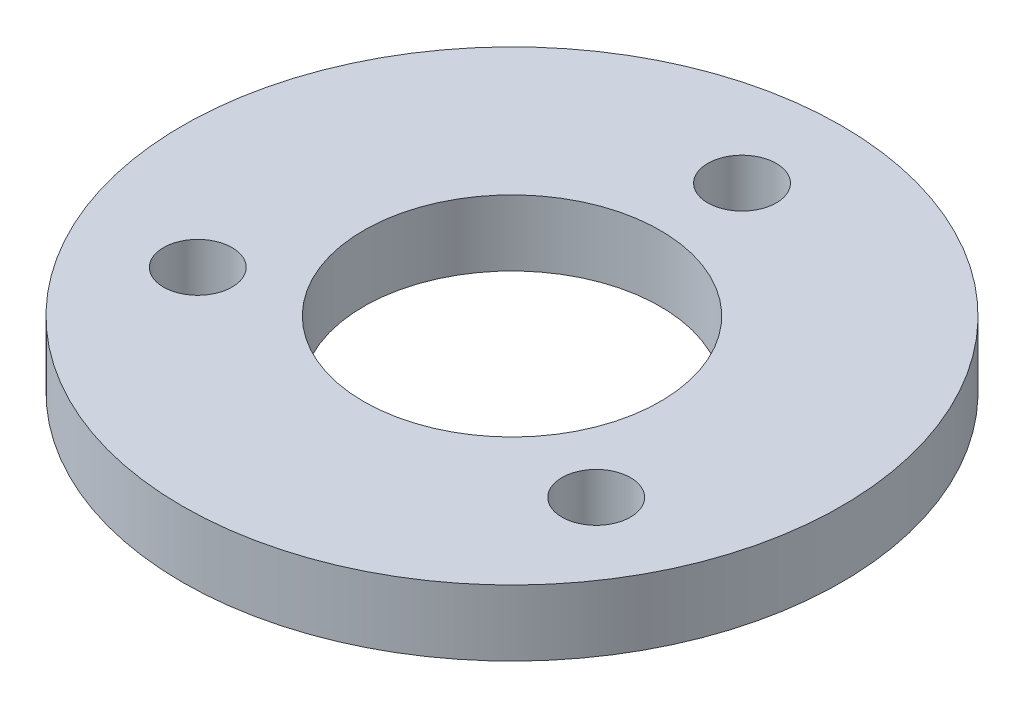
ISO-10303-21;
HEADER;
FILE_DESCRIPTION(('STEP AP214'),'2;1');
FILE_NAME('part.step','',(''),(''),'','','');
FILE_SCHEMA(('AUTOMOTIVE_DESIGN { 1 0 10303 214 1 1 1 1 }'));
ENDSEC;
DATA;
#1=APPLICATION_CONTEXT('core data for automotive mechanical design processes');
#2=APPLICATION_PROTOCOL_DEFINITION('international standard','automotive_design',2000,#1);
#3=PRODUCT_CONTEXT('',#1,'mechanical');
#4=PRODUCT('Part','Part','',(#3));
#5=PRODUCT_RELATED_PRODUCT_CATEGORY('part','',(#4));
#6=PRODUCT_DEFINITION_FORMATION('','',#4);
#7=PRODUCT_DEFINITION_CONTEXT('part definition',#1,'design');
#8=PRODUCT_DEFINITION('design','',#6,#7);
#9=PRODUCT_DEFINITION_SHAPE('','',#8);
#10=(LENGTH_UNIT() NAMED_UNIT(*) SI_UNIT(.MILLI.,.METRE.));
#11=(NAMED_UNIT(*) PLANE_ANGLE_UNIT() SI_UNIT($,.RADIAN.));
#12=(NAMED_UNIT(*) SI_UNIT($,.STERADIAN.) SOLID_ANGLE_UNIT());
#13=UNCERTAINTY_MEASURE_WITH_UNIT(LENGTH_MEASURE(1.E-05),#10,'distance_accuracy_value','');
#14=(GEOMETRIC_REPRESENTATION_CONTEXT(3) GLOBAL_UNCERTAINTY_ASSIGNED_CONTEXT((#13)) GLOBAL_UNIT_ASSIGNED_CONTEXT((#10,
#11,#12)) REPRESENTATION_CONTEXT('',''));
#15=CARTESIAN_POINT('',(0.,0.,0.));
#16=DIRECTION('',(0.,0.,1.));
#17=DIRECTION('',(1.,0.,0.));
#18=AXIS2_PLACEMENT_3D('',#15,#16,#17);
#19=CARTESIAN_POINT('',(0.,5.,0.));
#20=DIRECTION('',(0.,1.,0.));
#21=DIRECTION('',(0.,0.,1.));
#22=AXIS2_PLACEMENT_3D('',#19,#20,#21);
#23=PLANE('',#22);
#24=CARTESIAN_POINT('',(15.1121432960413,5.,8.72499999999836));
#25=DIRECTION('',(0.,1.,0.));
#26=DIRECTION('',(0.,0.,1.));
#27=AXIS2_PLACEMENT_3D('',#24,#25,#26);
#28=CIRCLE('',#27,2.6);
#29=CARTESIAN_POINT('',(15.1121432960413,5.,11.3249999999984));
#30=VERTEX_POINT('',#29);
#31=EDGE_CURVE('E57',#30,#30,#28,.T.);
#32=ORIENTED_EDGE('',*,*,#31,.F.);
#33=EDGE_LOOP('',(#32));
#34=FACE_BOUND('',#33,.T.);
#35=CARTESIAN_POINT('',(0.,5.,-17.45));
#36=DIRECTION('',(0.,1.,0.));
#37=DIRECTION('',(0.,0.,1.));
#38=AXIS2_PLACEMENT_3D('',#35,#36,#37);
#39=CIRCLE('',#38,2.6);
#40=CARTESIAN_POINT('',(0.,5.,-14.85));
#41=VERTEX_POINT('',#40);
#42=EDGE_CURVE('E46',#41,#41,#39,.T.);
#43=ORIENTED_EDGE('',*,*,#42,.F.);
#44=EDGE_LOOP('',(#43));
#45=FACE_BOUND('',#44,.T.);
#46=CARTESIAN_POINT('',(0.,5.,0.));
#47=DIRECTION('',(0.,1.,0.));
#48=DIRECTION('',(0.,0.,1.));
#49=AXIS2_PLACEMENT_3D('',#46,#47,#48);
#50=CIRCLE('',#49,25.);
#51=CARTESIAN_POINT('',(0.,5.,25.));
#52=VERTEX_POINT('',#51);
#53=EDGE_CURVE('E10',#52,#52,#50,.T.);
#54=ORIENTED_EDGE('',*,*,#53,.T.);
#55=EDGE_LOOP('',(#54));
#56=FACE_BOUND('',#55,.T.);
#57=CARTESIAN_POINT('',(0.,5.,0.));
#58=DIRECTION('',(0.,1.,0.));
#59=DIRECTION('',(0.,0.,1.));
#60=AXIS2_PLACEMENT_3D('',#57,#58,#59);
#61=CIRCLE('',#60,11.25);
#62=CARTESIAN_POINT('',(0.,5.,11.25));
#63=VERTEX_POINT('',#62);
#64=EDGE_CURVE('E51',#63,#63,#61,.T.);
#65=ORIENTED_EDGE('',*,*,#64,.F.);
#66=EDGE_LOOP('',(#65));
#67=FACE_BOUND('',#66,.T.);
#68=CARTESIAN_POINT('',(-15.1121432960356,5.,8.72500000000164));
#69=DIRECTION('',(0.,1.,0.));
#70=DIRECTION('',(0.,0.,1.));
#71=AXIS2_PLACEMENT_3D('',#68,#69,#70);
#72=CIRCLE('',#71,2.6);
#73=CARTESIAN_POINT('',(-15.1121432960356,5.,11.3250000000016));
#74=VERTEX_POINT('',#73);
#75=EDGE_CURVE('E63',#74,#74,#72,.T.);
#76=ORIENTED_EDGE('',*,*,#75,.F.);
#77=EDGE_LOOP('',(#76));
#78=FACE_BOUND('',#77,.T.);
#79=ADVANCED_FACE('F35',(#34,#45,#56,#67,#78),#23,.T.);
#80=CARTESIAN_POINT('',(0.,0.,0.));
#81=DIRECTION('',(0.,1.,0.));
#82=DIRECTION('',(0.,0.,1.));
#83=AXIS2_PLACEMENT_3D('',#80,#81,#82);
#84=PLANE('',#83);
#85=CARTESIAN_POINT('',(0.,0.,0.));
#86=DIRECTION('',(0.,1.,0.));
#87=DIRECTION('',(0.,0.,1.));
#88=AXIS2_PLACEMENT_3D('',#85,#86,#87);
#89=CIRCLE('',#88,25.);
#90=CARTESIAN_POINT('',(0.,0.,25.));
#91=VERTEX_POINT('',#90);
#92=EDGE_CURVE('E39',#91,#91,#89,.T.);
#93=ORIENTED_EDGE('',*,*,#92,.F.);
#94=EDGE_LOOP('',(#93));
#95=FACE_BOUND('',#94,.T.);
#96=CARTESIAN_POINT('',(0.,0.,-17.45));
#97=DIRECTION('',(0.,1.,0.));
#98=DIRECTION('',(0.,0.,1.));
#99=AXIS2_PLACEMENT_3D('',#96,#97,#98);
#100=CIRCLE('',#99,2.6);
#101=CARTESIAN_POINT('',(0.,0.,-14.85));
#102=VERTEX_POINT('',#101);
#103=EDGE_CURVE('E48',#102,#102,#100,.T.);
#104=ORIENTED_EDGE('',*,*,#103,.T.);
#105=EDGE_LOOP('',(#104));
#106=FACE_BOUND('',#105,.T.);
#107=CARTESIAN_POINT('',(0.,0.,0.));
#108=DIRECTION('',(0.,1.,0.));
#109=DIRECTION('',(0.,0.,1.));
#110=AXIS2_PLACEMENT_3D('',#107,#108,#109);
#111=CIRCLE('',#110,11.25);
#112=CARTESIAN_POINT('',(0.,0.,11.25));
#113=VERTEX_POINT('',#112);
#114=EDGE_CURVE('E54',#113,#113,#111,.T.);
#115=ORIENTED_EDGE('',*,*,#114,.T.);
#116=EDGE_LOOP('',(#115));
#117=FACE_BOUND('',#116,.T.);
#118=CARTESIAN_POINT('',(15.1121432960413,0.,8.72499999999836));
#119=DIRECTION('',(0.,1.,0.));
#120=DIRECTION('',(0.,0.,1.));
#121=AXIS2_PLACEMENT_3D('',#118,#119,#120);
#122=CIRCLE('',#121,2.6);
#123=CARTESIAN_POINT('',(15.1121432960413,0.,11.3249999999984));
#124=VERTEX_POINT('',#123);
#125=EDGE_CURVE('E60',#124,#124,#122,.T.);
#126=ORIENTED_EDGE('',*,*,#125,.T.);
#127=EDGE_LOOP('',(#126));
#128=FACE_BOUND('',#127,.T.);
#129=CARTESIAN_POINT('',(-15.1121432960356,0.,8.72500000000164));
#130=DIRECTION('',(0.,1.,0.));
#131=DIRECTION('',(0.,0.,1.));
#132=AXIS2_PLACEMENT_3D('',#129,#130,#131);
#133=CIRCLE('',#132,2.6);
#134=CARTESIAN_POINT('',(-15.1121432960356,0.,11.3250000000016));
#135=VERTEX_POINT('',#134);
#136=EDGE_CURVE('E66',#135,#135,#133,.T.);
#137=ORIENTED_EDGE('',*,*,#136,.T.);
#138=EDGE_LOOP('',(#137));
#139=FACE_BOUND('',#138,.T.);
#140=ADVANCED_FACE('F76',(#95,#106,#117,#128,#139),#84,.F.);
#141=CARTESIAN_POINT('',(0.,5.,0.));
#142=DIRECTION('',(0.,-1.,0.));
#143=DIRECTION('',(0.,0.,-1.));
#144=AXIS2_PLACEMENT_3D('',#141,#142,#143);
#145=CYLINDRICAL_SURFACE('',#144,25.);
#146=ORIENTED_EDGE('',*,*,#53,.F.);
#147=EDGE_LOOP('',(#146));
#148=FACE_BOUND('',#147,.T.);
#149=ORIENTED_EDGE('',*,*,#92,.T.);
#150=EDGE_LOOP('',(#149));
#151=FACE_BOUND('',#150,.T.);
#152=ADVANCED_FACE('F37',(#148,#151),#145,.T.);
#153=CARTESIAN_POINT('',(0.,5.,-17.45));
#154=DIRECTION('',(0.,-1.,0.));
#155=DIRECTION('',(0.,0.,-1.));
#156=AXIS2_PLACEMENT_3D('',#153,#154,#155);
#157=CYLINDRICAL_SURFACE('',#156,2.6);
#158=ORIENTED_EDGE('',*,*,#42,.T.);
#159=EDGE_LOOP('',(#158));
#160=FACE_BOUND('',#159,.T.);
#161=ORIENTED_EDGE('',*,*,#103,.F.);
#162=EDGE_LOOP('',(#161));
#163=FACE_BOUND('',#162,.T.);
#164=ADVANCED_FACE('F86',(#160,#163),#157,.F.);
#165=CARTESIAN_POINT('',(0.,5.,0.));
#166=DIRECTION('',(0.,-1.,0.));
#167=DIRECTION('',(0.,0.,-1.));
#168=AXIS2_PLACEMENT_3D('',#165,#166,#167);
#169=CYLINDRICAL_SURFACE('',#168,11.25);
#170=ORIENTED_EDGE('',*,*,#64,.T.);
#171=EDGE_LOOP('',(#170));
#172=FACE_BOUND('',#171,.T.);
#173=ORIENTED_EDGE('',*,*,#114,.F.);
#174=EDGE_LOOP('',(#173));
#175=FACE_BOUND('',#174,.T.);
#176=ADVANCED_FACE('F89',(#172,#175),#169,.F.);
#177=CARTESIAN_POINT('',(15.1121432960413,5.,8.72499999999836));
#178=DIRECTION('',(0.,-1.,0.));
#179=DIRECTION('',(0.,0.,-1.));
#180=AXIS2_PLACEMENT_3D('',#177,#178,#179);
#181=CYLINDRICAL_SURFACE('',#180,2.6);
#182=ORIENTED_EDGE('',*,*,#31,.T.);
#183=EDGE_LOOP('',(#182));
#184=FACE_BOUND('',#183,.T.);
#185=ORIENTED_EDGE('',*,*,#125,.F.);
#186=EDGE_LOOP('',(#185));
#187=FACE_BOUND('',#186,.T.);
#188=ADVANCED_FACE('F93',(#184,#187),#181,.F.);
#189=CARTESIAN_POINT('',(-15.1121432960356,5.,8.72500000000164));
#190=DIRECTION('',(0.,-1.,0.));
#191=DIRECTION('',(0.,0.,-1.));
#192=AXIS2_PLACEMENT_3D('',#189,#190,#191);
#193=CYLINDRICAL_SURFACE('',#192,2.6);
#194=ORIENTED_EDGE('',*,*,#75,.T.);
#195=EDGE_LOOP('',(#194));
#196=FACE_BOUND('',#195,.T.);
#197=ORIENTED_EDGE('',*,*,#136,.F.);
#198=EDGE_LOOP('',(#197));
#199=FACE_BOUND('',#198,.T.);
#200=ADVANCED_FACE('F72',(#196,#199),#193,.F.);
#201=CLOSED_SHELL('',(#79,#140,#152,#164,#176,#188,#200));
#202=MANIFOLD_SOLID_BREP('B2',#201);
#203=ADVANCED_BREP_SHAPE_REPRESENTATION('',(#18,#202),#14);
#204=SHAPE_DEFINITION_REPRESENTATION(#9,#203);
ENDSEC;
END-ISO-10303-21;
